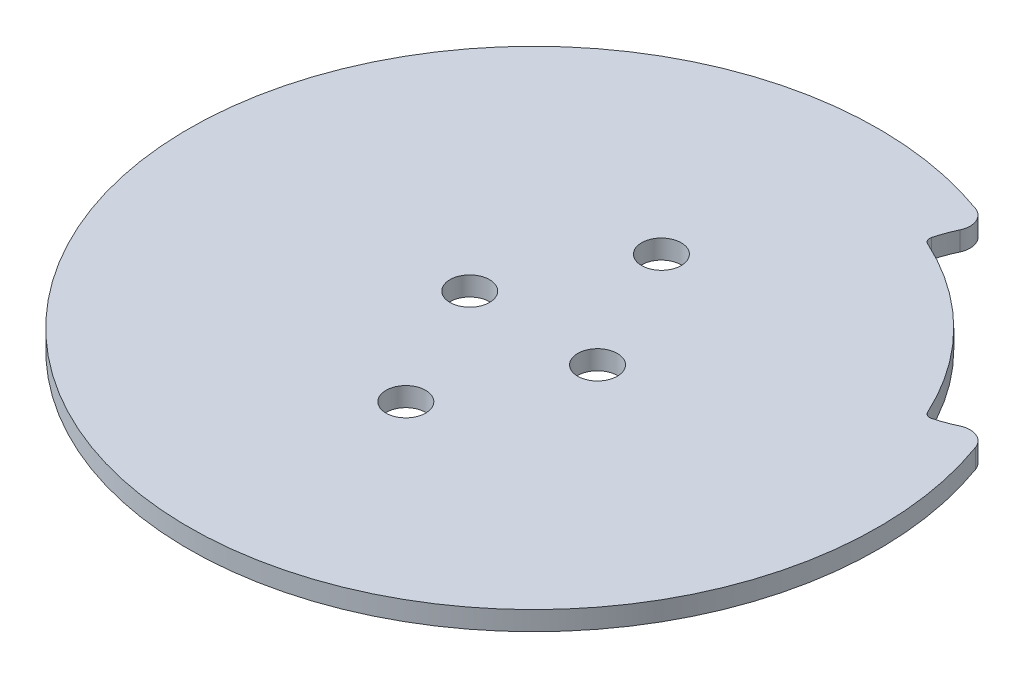
ISO-10303-21;
HEADER;
FILE_DESCRIPTION(('STEP AP214'),'2;1');
FILE_NAME('part.step','',(''),(''),'','','');
FILE_SCHEMA(('AUTOMOTIVE_DESIGN { 1 0 10303 214 1 1 1 1 }'));
ENDSEC;
DATA;
#1=APPLICATION_CONTEXT('core data for automotive mechanical design processes');
#2=APPLICATION_PROTOCOL_DEFINITION('international standard','automotive_design',2000,#1);
#3=PRODUCT_CONTEXT('',#1,'mechanical');
#4=PRODUCT('Part','Part','',(#3));
#5=PRODUCT_RELATED_PRODUCT_CATEGORY('part','',(#4));
#6=PRODUCT_DEFINITION_FORMATION('','',#4);
#7=PRODUCT_DEFINITION_CONTEXT('part definition',#1,'design');
#8=PRODUCT_DEFINITION('design','',#6,#7);
#9=PRODUCT_DEFINITION_SHAPE('','',#8);
#10=(LENGTH_UNIT() NAMED_UNIT(*) SI_UNIT(.MILLI.,.METRE.));
#11=(NAMED_UNIT(*) PLANE_ANGLE_UNIT() SI_UNIT($,.RADIAN.));
#12=(NAMED_UNIT(*) SI_UNIT($,.STERADIAN.) SOLID_ANGLE_UNIT());
#13=UNCERTAINTY_MEASURE_WITH_UNIT(LENGTH_MEASURE(1.E-05),#10,'distance_accuracy_value','');
#14=(GEOMETRIC_REPRESENTATION_CONTEXT(3) GLOBAL_UNCERTAINTY_ASSIGNED_CONTEXT((#13)) GLOBAL_UNIT_ASSIGNED_CONTEXT((#10,
#11,#12)) REPRESENTATION_CONTEXT('',''));
#15=CARTESIAN_POINT('',(0.,0.,0.));
#16=DIRECTION('',(0.,0.,1.));
#17=DIRECTION('',(1.,0.,0.));
#18=AXIS2_PLACEMENT_3D('',#15,#16,#17);
#19=CARTESIAN_POINT('',(38.1837661840735,3.,-38.1837661840737));
#20=DIRECTION('',(0.,-1.,0.));
#21=DIRECTION('',(0.,0.,-1.));
#22=AXIS2_PLACEMENT_3D('',#19,#20,#21);
#23=CYLINDRICAL_SURFACE('',#22,20.);
#24=CARTESIAN_POINT('',(38.1837661840735,0.,-38.1837661840737));
#25=DIRECTION('',(0.,1.,0.));
#26=DIRECTION('',(0.,0.,1.));
#27=AXIS2_PLACEMENT_3D('',#24,#25,#26);
#28=CIRCLE('',#27,20.);
#29=CARTESIAN_POINT('',(43.417148207862,0.,-18.8806132656231));
#30=VERTEX_POINT('',#29);
#31=CARTESIAN_POINT('',(46.6794046105511,0.,-20.0778520197306));
#32=VERTEX_POINT('',#31);
#33=EDGE_CURVE('E103',#30,#32,#28,.T.);
#34=ORIENTED_EDGE('',*,*,#33,.F.);
#35=DIRECTION('',(0.,-1.,0.));
#36=VECTOR('',#35,1.);
#37=CARTESIAN_POINT('',(43.417148207862,3.,-18.8806132656231));
#38=LINE('',#37,#36);
#39=CARTESIAN_POINT('',(43.417148207862,3.,-18.8806132656231));
#40=VERTEX_POINT('',#39);
#41=EDGE_CURVE('E155',#30,#40,#38,.F.);
#42=ORIENTED_EDGE('',*,*,#41,.T.);
#43=CARTESIAN_POINT('',(38.1837661840735,3.,-38.1837661840737));
#44=DIRECTION('',(0.,1.,0.));
#45=DIRECTION('',(0.,0.,1.));
#46=AXIS2_PLACEMENT_3D('',#43,#44,#45);
#47=CIRCLE('',#46,20.);
#48=CARTESIAN_POINT('',(46.6794046105511,3.,-20.0778520197306));
#49=VERTEX_POINT('',#48);
#50=EDGE_CURVE('E129',#40,#49,#47,.T.);
#51=ORIENTED_EDGE('',*,*,#50,.T.);
#52=DIRECTION('',(0.,-1.,0.));
#53=VECTOR('',#52,1.);
#54=CARTESIAN_POINT('',(46.6794046105511,3.,-20.0778520197306));
#55=LINE('',#54,#53);
#56=EDGE_CURVE('E123',#49,#32,#55,.T.);
#57=ORIENTED_EDGE('',*,*,#56,.T.);
#58=EDGE_LOOP('',(#34,#42,#51,#57));
#59=FACE_BOUND('',#58,.T.);
#60=ADVANCED_FACE('F39',(#59),#23,.F.);
#61=CARTESIAN_POINT('',(0.,3.,0.));
#62=DIRECTION('',(0.,-1.,0.));
#63=DIRECTION('',(0.,0.,-1.));
#64=AXIS2_PLACEMENT_3D('',#61,#62,#63);
#65=CYLINDRICAL_SURFACE('',#64,46.5);
#66=CARTESIAN_POINT('',(0.,3.,0.));
#67=DIRECTION('',(0.,1.,0.));
#68=DIRECTION('',(0.,0.,1.));
#69=AXIS2_PLACEMENT_3D('',#66,#67,#68);
#70=CIRCLE('',#69,46.5);
#71=CARTESIAN_POINT('',(42.2469427044268,3.,-19.4279652081447));
#72=VERTEX_POINT('',#71);
#73=CARTESIAN_POINT('',(19.4279652081445,3.,-42.2469427044269));
#74=VERTEX_POINT('',#73);
#75=EDGE_CURVE('E175',#72,#74,#70,.T.);
#76=ORIENTED_EDGE('',*,*,#75,.F.);
#77=DIRECTION('',(0.,-1.,0.));
#78=VECTOR('',#77,1.);
#79=CARTESIAN_POINT('',(42.2469427044268,3.,-19.4279652081447));
#80=LINE('',#79,#78);
#81=CARTESIAN_POINT('',(42.2469427044268,0.,-19.4279652081447));
#82=VERTEX_POINT('',#81);
#83=EDGE_CURVE('E152',#72,#82,#80,.T.);
#84=ORIENTED_EDGE('',*,*,#83,.T.);
#85=CARTESIAN_POINT('',(0.,0.,0.));
#86=DIRECTION('',(0.,1.,0.));
#87=DIRECTION('',(0.,0.,1.));
#88=AXIS2_PLACEMENT_3D('',#85,#86,#87);
#89=CIRCLE('',#88,46.5);
#90=CARTESIAN_POINT('',(19.4279652081445,0.,-42.2469427044269));
#91=VERTEX_POINT('',#90);
#92=EDGE_CURVE('E115',#82,#91,#89,.T.);
#93=ORIENTED_EDGE('',*,*,#92,.T.);
#94=DIRECTION('',(0.,-1.,0.));
#95=VECTOR('',#94,1.);
#96=CARTESIAN_POINT('',(19.4279652081445,3.,-42.2469427044269));
#97=LINE('',#96,#95);
#98=EDGE_CURVE('E150',#91,#74,#97,.F.);
#99=ORIENTED_EDGE('',*,*,#98,.T.);
#100=EDGE_LOOP('',(#76,#84,#93,#99));
#101=FACE_BOUND('',#100,.T.);
#102=ADVANCED_FACE('F166',(#101),#65,.T.);
#103=CARTESIAN_POINT('',(20.0778520197304,3.,-46.6794046105512));
#104=VERTEX_POINT('',#103);
#105=CARTESIAN_POINT('',(18.8806132656229,3.,-43.4171482078621));
#106=VERTEX_POINT('',#105);
#107=EDGE_CURVE('E172',#104,#106,#47,.T.);
#108=ORIENTED_EDGE('',*,*,#107,.T.);
#109=DIRECTION('',(0.,-1.,0.));
#110=VECTOR('',#109,1.);
#111=CARTESIAN_POINT('',(18.8806132656229,3.,-43.4171482078621));
#112=LINE('',#111,#110);
#113=CARTESIAN_POINT('',(18.8806132656229,0.,-43.4171482078621));
#114=VERTEX_POINT('',#113);
#115=EDGE_CURVE('E157',#106,#114,#112,.T.);
#116=ORIENTED_EDGE('',*,*,#115,.T.);
#117=CARTESIAN_POINT('',(20.0778520197304,0.,-46.6794046105512));
#118=VERTEX_POINT('',#117);
#119=EDGE_CURVE('E117',#118,#114,#28,.T.);
#120=ORIENTED_EDGE('',*,*,#119,.F.);
#121=DIRECTION('',(0.,-1.,0.));
#122=VECTOR('',#121,1.);
#123=CARTESIAN_POINT('',(20.0778520197304,3.,-46.6794046105512));
#124=LINE('',#123,#122);
#125=EDGE_CURVE('E148',#118,#104,#124,.F.);
#126=ORIENTED_EDGE('',*,*,#125,.T.);
#127=EDGE_LOOP('',(#108,#116,#120,#126));
#128=FACE_BOUND('',#127,.T.);
#129=ADVANCED_FACE('F170',(#128),#23,.F.);
#130=CARTESIAN_POINT('',(0.,3.,20.));
#131=DIRECTION('',(0.,-1.,0.));
#132=DIRECTION('',(0.,0.,-1.));
#133=AXIS2_PLACEMENT_3D('',#130,#131,#132);
#134=CYLINDRICAL_SURFACE('',#133,3.1);
#135=CARTESIAN_POINT('',(0.,3.,20.));
#136=DIRECTION('',(0.,1.,0.));
#137=DIRECTION('',(0.,0.,1.));
#138=AXIS2_PLACEMENT_3D('',#135,#136,#137);
#139=CIRCLE('',#138,3.1);
#140=CARTESIAN_POINT('',(0.,3.,23.1));
#141=VERTEX_POINT('',#140);
#142=EDGE_CURVE('E135',#141,#141,#139,.T.);
#143=ORIENTED_EDGE('',*,*,#142,.T.);
#144=EDGE_LOOP('',(#143));
#145=FACE_BOUND('',#144,.T.);
#146=CARTESIAN_POINT('',(0.,0.,20.));
#147=DIRECTION('',(0.,1.,0.));
#148=DIRECTION('',(0.,0.,1.));
#149=AXIS2_PLACEMENT_3D('',#146,#147,#148);
#150=CIRCLE('',#149,3.1);
#151=CARTESIAN_POINT('',(0.,0.,23.1));
#152=VERTEX_POINT('',#151);
#153=EDGE_CURVE('E182',#152,#152,#150,.T.);
#154=ORIENTED_EDGE('',*,*,#153,.F.);
#155=EDGE_LOOP('',(#154));
#156=FACE_BOUND('',#155,.T.);
#157=ADVANCED_FACE('F237',(#145,#156),#134,.F.);
#158=CARTESIAN_POINT('',(-10.,3.,0.));
#159=DIRECTION('',(0.,-1.,0.));
#160=DIRECTION('',(0.,0.,-1.));
#161=AXIS2_PLACEMENT_3D('',#158,#159,#160);
#162=CYLINDRICAL_SURFACE('',#161,3.1);
#163=CARTESIAN_POINT('',(-10.,3.,0.));
#164=DIRECTION('',(0.,1.,0.));
#165=DIRECTION('',(0.,0.,1.));
#166=AXIS2_PLACEMENT_3D('',#163,#164,#165);
#167=CIRCLE('',#166,3.1);
#168=CARTESIAN_POINT('',(-10.,3.,3.1));
#169=VERTEX_POINT('',#168);
#170=EDGE_CURVE('E199',#169,#169,#167,.T.);
#171=ORIENTED_EDGE('',*,*,#170,.T.);
#172=EDGE_LOOP('',(#171));
#173=FACE_BOUND('',#172,.T.);
#174=CARTESIAN_POINT('',(-10.,0.,0.));
#175=DIRECTION('',(0.,1.,0.));
#176=DIRECTION('',(0.,0.,1.));
#177=AXIS2_PLACEMENT_3D('',#174,#175,#176);
#178=CIRCLE('',#177,3.1);
#179=CARTESIAN_POINT('',(-10.,0.,3.1));
#180=VERTEX_POINT('',#179);
#181=EDGE_CURVE('E186',#180,#180,#178,.T.);
#182=ORIENTED_EDGE('',*,*,#181,.F.);
#183=EDGE_LOOP('',(#182));
#184=FACE_BOUND('',#183,.T.);
#185=ADVANCED_FACE('F241',(#173,#184),#162,.F.);
#186=CARTESIAN_POINT('',(10.,3.,0.));
#187=DIRECTION('',(0.,-1.,0.));
#188=DIRECTION('',(0.,0.,-1.));
#189=AXIS2_PLACEMENT_3D('',#186,#187,#188);
#190=CYLINDRICAL_SURFACE('',#189,3.1);
#191=CARTESIAN_POINT('',(10.,3.,0.));
#192=DIRECTION('',(0.,1.,0.));
#193=DIRECTION('',(0.,0.,1.));
#194=AXIS2_PLACEMENT_3D('',#191,#192,#193);
#195=CIRCLE('',#194,3.1);
#196=CARTESIAN_POINT('',(10.,3.,3.1));
#197=VERTEX_POINT('',#196);
#198=EDGE_CURVE('E178',#197,#197,#195,.T.);
#199=ORIENTED_EDGE('',*,*,#198,.T.);
#200=EDGE_LOOP('',(#199));
#201=FACE_BOUND('',#200,.T.);
#202=CARTESIAN_POINT('',(10.,0.,0.));
#203=DIRECTION('',(0.,1.,0.));
#204=DIRECTION('',(0.,0.,1.));
#205=AXIS2_PLACEMENT_3D('',#202,#203,#204);
#206=CIRCLE('',#205,3.1);
#207=CARTESIAN_POINT('',(10.,0.,3.1));
#208=VERTEX_POINT('',#207);
#209=EDGE_CURVE('E190',#208,#208,#206,.T.);
#210=ORIENTED_EDGE('',*,*,#209,.F.);
#211=EDGE_LOOP('',(#210));
#212=FACE_BOUND('',#211,.T.);
#213=ADVANCED_FACE('F205',(#201,#212),#190,.F.);
#214=CARTESIAN_POINT('',(0.,3.,0.));
#215=DIRECTION('',(0.,-1.,0.));
#216=DIRECTION('',(0.,0.,-1.));
#217=AXIS2_PLACEMENT_3D('',#214,#215,#216);
#218=CYLINDRICAL_SURFACE('',#217,54.);
#219=CARTESIAN_POINT('',(0.,0.,0.));
#220=DIRECTION('',(0.,1.,0.));
#221=DIRECTION('',(0.,0.,1.));
#222=AXIS2_PLACEMENT_3D('',#219,#220,#221);
#223=CIRCLE('',#222,54.);
#224=CARTESIAN_POINT('',(18.3832569477307,0.,-50.774559220083));
#225=VERTEX_POINT('',#224);
#226=CARTESIAN_POINT('',(50.7745592200829,0.,-18.3832569477309));
#227=VERTEX_POINT('',#226);
#228=EDGE_CURVE('E195',#225,#227,#223,.T.);
#229=ORIENTED_EDGE('',*,*,#228,.T.);
#230=DIRECTION('',(0.,-1.,0.));
#231=VECTOR('',#230,1.);
#232=CARTESIAN_POINT('',(50.7745592200829,3.,-18.3832569477309));
#233=LINE('',#232,#231);
#234=CARTESIAN_POINT('',(50.7745592200829,3.,-18.3832569477309));
#235=VERTEX_POINT('',#234);
#236=EDGE_CURVE('E124',#227,#235,#233,.F.);
#237=ORIENTED_EDGE('',*,*,#236,.T.);
#238=CARTESIAN_POINT('',(0.,3.,0.));
#239=DIRECTION('',(0.,1.,0.));
#240=DIRECTION('',(0.,0.,1.));
#241=AXIS2_PLACEMENT_3D('',#238,#239,#240);
#242=CIRCLE('',#241,54.);
#243=CARTESIAN_POINT('',(18.3832569477307,3.,-50.774559220083));
#244=VERTEX_POINT('',#243);
#245=EDGE_CURVE('E174',#244,#235,#242,.T.);
#246=ORIENTED_EDGE('',*,*,#245,.F.);
#247=DIRECTION('',(0.,-1.,0.));
#248=VECTOR('',#247,1.);
#249=CARTESIAN_POINT('',(18.3832569477307,3.,-50.774559220083));
#250=LINE('',#249,#248);
#251=EDGE_CURVE('E125',#244,#225,#250,.T.);
#252=ORIENTED_EDGE('',*,*,#251,.T.);
#253=EDGE_LOOP('',(#229,#237,#246,#252));
#254=FACE_BOUND('',#253,.T.);
#255=ADVANCED_FACE('F221',(#254),#218,.T.);
#256=CARTESIAN_POINT('',(0.,3.,-20.));
#257=DIRECTION('',(0.,-1.,0.));
#258=DIRECTION('',(0.,0.,-1.));
#259=AXIS2_PLACEMENT_3D('',#256,#257,#258);
#260=CYLINDRICAL_SURFACE('',#259,3.1);
#261=CARTESIAN_POINT('',(0.,3.,-20.));
#262=DIRECTION('',(0.,1.,0.));
#263=DIRECTION('',(0.,0.,1.));
#264=AXIS2_PLACEMENT_3D('',#261,#262,#263);
#265=CIRCLE('',#264,3.1);
#266=CARTESIAN_POINT('',(0.,3.,-16.9));
#267=VERTEX_POINT('',#266);
#268=EDGE_CURVE('E131',#267,#267,#265,.T.);
#269=ORIENTED_EDGE('',*,*,#268,.T.);
#270=EDGE_LOOP('',(#269));
#271=FACE_BOUND('',#270,.T.);
#272=CARTESIAN_POINT('',(0.,0.,-20.));
#273=DIRECTION('',(0.,1.,0.));
#274=DIRECTION('',(0.,0.,1.));
#275=AXIS2_PLACEMENT_3D('',#272,#273,#274);
#276=CIRCLE('',#275,3.1);
#277=CARTESIAN_POINT('',(0.,0.,-16.9));
#278=VERTEX_POINT('',#277);
#279=EDGE_CURVE('E138',#278,#278,#276,.T.);
#280=ORIENTED_EDGE('',*,*,#279,.F.);
#281=EDGE_LOOP('',(#280));
#282=FACE_BOUND('',#281,.T.);
#283=ADVANCED_FACE('F211',(#271,#282),#260,.F.);
#284=CARTESIAN_POINT('',(0.,3.,0.));
#285=DIRECTION('',(0.,1.,0.));
#286=DIRECTION('',(0.,0.,1.));
#287=AXIS2_PLACEMENT_3D('',#284,#285,#286);
#288=PLANE('',#287);
#289=ORIENTED_EDGE('',*,*,#245,.T.);
#290=CARTESIAN_POINT('',(47.9537503745227,3.,-17.3619648950792));
#291=DIRECTION('',(0.,1.,0.));
#292=DIRECTION('',(0.,0.,1.));
#293=AXIS2_PLACEMENT_3D('',#290,#291,#292);
#294=CIRCLE('',#293,3.);
#295=EDGE_CURVE('E146',#235,#49,#294,.T.);
#296=ORIENTED_EDGE('',*,*,#295,.T.);
#297=ORIENTED_EDGE('',*,*,#50,.F.);
#298=CARTESIAN_POINT('',(43.1554791066725,3.,-19.8457709115456));
#299=DIRECTION('',(0.,1.,0.));
#300=DIRECTION('',(0.,0.,1.));
#301=AXIS2_PLACEMENT_3D('',#298,#299,#300);
#302=CIRCLE('',#301,1.);
#303=EDGE_CURVE('E160',#40,#72,#302,.F.);
#304=ORIENTED_EDGE('',*,*,#303,.T.);
#305=ORIENTED_EDGE('',*,*,#75,.T.);
#306=CARTESIAN_POINT('',(19.8457709115454,3.,-43.1554791066726));
#307=DIRECTION('',(0.,1.,0.));
#308=DIRECTION('',(0.,0.,1.));
#309=AXIS2_PLACEMENT_3D('',#306,#307,#308);
#310=CIRCLE('',#309,1.);
#311=EDGE_CURVE('E11',#74,#106,#310,.F.);
#312=ORIENTED_EDGE('',*,*,#311,.T.);
#313=ORIENTED_EDGE('',*,*,#107,.F.);
#314=CARTESIAN_POINT('',(17.361964895079,3.,-47.9537503745228));
#315=DIRECTION('',(0.,1.,0.));
#316=DIRECTION('',(0.,0.,1.));
#317=AXIS2_PLACEMENT_3D('',#314,#315,#316);
#318=CIRCLE('',#317,3.);
#319=EDGE_CURVE('E144',#104,#244,#318,.T.);
#320=ORIENTED_EDGE('',*,*,#319,.T.);
#321=EDGE_LOOP('',(#289,#296,#297,#304,#305,#312,#313,#320));
#322=FACE_BOUND('',#321,.T.);
#323=ORIENTED_EDGE('',*,*,#198,.F.);
#324=EDGE_LOOP('',(#323));
#325=FACE_BOUND('',#324,.T.);
#326=ORIENTED_EDGE('',*,*,#170,.F.);
#327=EDGE_LOOP('',(#326));
#328=FACE_BOUND('',#327,.T.);
#329=ORIENTED_EDGE('',*,*,#142,.F.);
#330=EDGE_LOOP('',(#329));
#331=FACE_BOUND('',#330,.T.);
#332=ORIENTED_EDGE('',*,*,#268,.F.);
#333=EDGE_LOOP('',(#332));
#334=FACE_BOUND('',#333,.T.);
#335=ADVANCED_FACE('F208',(#322,#325,#328,#331,#334),#288,.T.);
#336=CARTESIAN_POINT('',(0.,0.,0.));
#337=DIRECTION('',(0.,1.,0.));
#338=DIRECTION('',(0.,0.,1.));
#339=AXIS2_PLACEMENT_3D('',#336,#337,#338);
#340=PLANE('',#339);
#341=ORIENTED_EDGE('',*,*,#92,.F.);
#342=CARTESIAN_POINT('',(43.1554791066725,0.,-19.8457709115456));
#343=DIRECTION('',(0.,1.,0.));
#344=DIRECTION('',(0.,0.,1.));
#345=AXIS2_PLACEMENT_3D('',#342,#343,#344);
#346=CIRCLE('',#345,1.);
#347=EDGE_CURVE('E111',#82,#30,#346,.T.);
#348=ORIENTED_EDGE('',*,*,#347,.T.);
#349=ORIENTED_EDGE('',*,*,#33,.T.);
#350=CARTESIAN_POINT('',(47.9537503745227,0.,-17.3619648950792));
#351=DIRECTION('',(0.,1.,0.));
#352=DIRECTION('',(0.,0.,1.));
#353=AXIS2_PLACEMENT_3D('',#350,#351,#352);
#354=CIRCLE('',#353,3.);
#355=EDGE_CURVE('E109',#32,#227,#354,.F.);
#356=ORIENTED_EDGE('',*,*,#355,.T.);
#357=ORIENTED_EDGE('',*,*,#228,.F.);
#358=CARTESIAN_POINT('',(17.361964895079,0.,-47.9537503745228));
#359=DIRECTION('',(0.,1.,0.));
#360=DIRECTION('',(0.,0.,1.));
#361=AXIS2_PLACEMENT_3D('',#358,#359,#360);
#362=CIRCLE('',#361,3.);
#363=EDGE_CURVE('E126',#225,#118,#362,.F.);
#364=ORIENTED_EDGE('',*,*,#363,.T.);
#365=ORIENTED_EDGE('',*,*,#119,.T.);
#366=CARTESIAN_POINT('',(19.8457709115454,0.,-43.1554791066726));
#367=DIRECTION('',(0.,1.,0.));
#368=DIRECTION('',(0.,0.,1.));
#369=AXIS2_PLACEMENT_3D('',#366,#367,#368);
#370=CIRCLE('',#369,1.);
#371=EDGE_CURVE('E47',#114,#91,#370,.T.);
#372=ORIENTED_EDGE('',*,*,#371,.T.);
#373=EDGE_LOOP('',(#341,#348,#349,#356,#357,#364,#365,#372));
#374=FACE_BOUND('',#373,.T.);
#375=ORIENTED_EDGE('',*,*,#209,.T.);
#376=EDGE_LOOP('',(#375));
#377=FACE_BOUND('',#376,.T.);
#378=ORIENTED_EDGE('',*,*,#181,.T.);
#379=EDGE_LOOP('',(#378));
#380=FACE_BOUND('',#379,.T.);
#381=ORIENTED_EDGE('',*,*,#153,.T.);
#382=EDGE_LOOP('',(#381));
#383=FACE_BOUND('',#382,.T.);
#384=ORIENTED_EDGE('',*,*,#279,.T.);
#385=EDGE_LOOP('',(#384));
#386=FACE_BOUND('',#385,.T.);
#387=ADVANCED_FACE('F106',(#374,#377,#380,#383,#386),#340,.F.);
#388=CARTESIAN_POINT('',(47.9537503745227,3.,-17.3619648950792));
#389=DIRECTION('',(0.,1.,0.));
#390=DIRECTION('',(0.,0.,1.));
#391=AXIS2_PLACEMENT_3D('',#388,#389,#390);
#392=CYLINDRICAL_SURFACE('',#391,3.);
#393=ORIENTED_EDGE('',*,*,#295,.F.);
#394=ORIENTED_EDGE('',*,*,#236,.F.);
#395=ORIENTED_EDGE('',*,*,#355,.F.);
#396=ORIENTED_EDGE('',*,*,#56,.F.);
#397=EDGE_LOOP('',(#393,#394,#395,#396));
#398=FACE_BOUND('',#397,.T.);
#399=ADVANCED_FACE('F122',(#398),#392,.T.);
#400=CARTESIAN_POINT('',(17.361964895079,3.,-47.9537503745228));
#401=DIRECTION('',(0.,1.,0.));
#402=DIRECTION('',(0.,0.,1.));
#403=AXIS2_PLACEMENT_3D('',#400,#401,#402);
#404=CYLINDRICAL_SURFACE('',#403,3.);
#405=ORIENTED_EDGE('',*,*,#319,.F.);
#406=ORIENTED_EDGE('',*,*,#125,.F.);
#407=ORIENTED_EDGE('',*,*,#363,.F.);
#408=ORIENTED_EDGE('',*,*,#251,.F.);
#409=EDGE_LOOP('',(#405,#406,#407,#408));
#410=FACE_BOUND('',#409,.T.);
#411=ADVANCED_FACE('F271',(#410),#404,.T.);
#412=CARTESIAN_POINT('',(43.1554791066725,3.,-19.8457709115456));
#413=DIRECTION('',(0.,-1.,0.));
#414=DIRECTION('',(0.,0.,-1.));
#415=AXIS2_PLACEMENT_3D('',#412,#413,#414);
#416=CYLINDRICAL_SURFACE('',#415,1.);
#417=ORIENTED_EDGE('',*,*,#303,.F.);
#418=ORIENTED_EDGE('',*,*,#41,.F.);
#419=ORIENTED_EDGE('',*,*,#347,.F.);
#420=ORIENTED_EDGE('',*,*,#83,.F.);
#421=EDGE_LOOP('',(#417,#418,#419,#420));
#422=FACE_BOUND('',#421,.T.);
#423=ADVANCED_FACE('F282',(#422),#416,.F.);
#424=CARTESIAN_POINT('',(19.8457709115454,3.,-43.1554791066726));
#425=DIRECTION('',(0.,-1.,0.));
#426=DIRECTION('',(0.,0.,-1.));
#427=AXIS2_PLACEMENT_3D('',#424,#425,#426);
#428=CYLINDRICAL_SURFACE('',#427,1.);
#429=ORIENTED_EDGE('',*,*,#311,.F.);
#430=ORIENTED_EDGE('',*,*,#98,.F.);
#431=ORIENTED_EDGE('',*,*,#371,.F.);
#432=ORIENTED_EDGE('',*,*,#115,.F.);
#433=EDGE_LOOP('',(#429,#430,#431,#432));
#434=FACE_BOUND('',#433,.T.);
#435=ADVANCED_FACE('F41',(#434),#428,.F.);
#436=CLOSED_SHELL('',(#60,#102,#129,#157,#185,#213,#255,#283,#335,#387,#399,#411,#423,#435));
#437=MANIFOLD_SOLID_BREP('B2',#436);
#438=ADVANCED_BREP_SHAPE_REPRESENTATION('',(#18,#437),#14);
#439=SHAPE_DEFINITION_REPRESENTATION(#9,#438);
ENDSEC;
END-ISO-10303-21;
